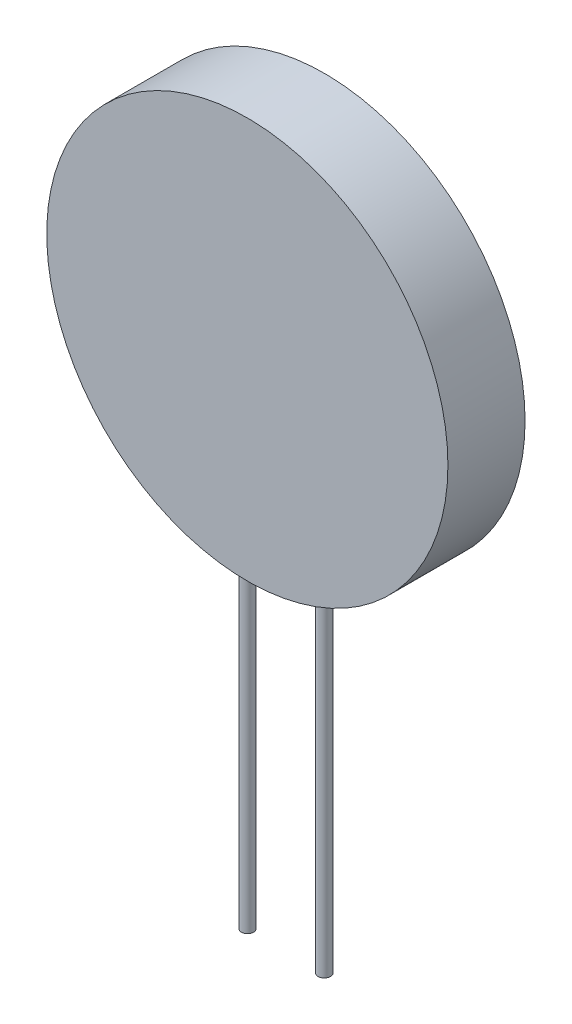
ISO-10303-21;
HEADER;
FILE_DESCRIPTION(('STEP AP214'),'2;1');
FILE_NAME('part.step','',(''),(''),'','','');
FILE_SCHEMA(('AUTOMOTIVE_DESIGN { 1 0 10303 214 1 1 1 1 }'));
ENDSEC;
DATA;
#1=APPLICATION_CONTEXT('core data for automotive mechanical design processes');
#2=APPLICATION_PROTOCOL_DEFINITION('international standard','automotive_design',2000,#1);
#3=PRODUCT_CONTEXT('',#1,'mechanical');
#4=PRODUCT('Part','Part','',(#3));
#5=PRODUCT_RELATED_PRODUCT_CATEGORY('part','',(#4));
#6=PRODUCT_DEFINITION_FORMATION('','',#4);
#7=PRODUCT_DEFINITION_CONTEXT('part definition',#1,'design');
#8=PRODUCT_DEFINITION('design','',#6,#7);
#9=PRODUCT_DEFINITION_SHAPE('','',#8);
#10=(LENGTH_UNIT() NAMED_UNIT(*) SI_UNIT(.MILLI.,.METRE.));
#11=(NAMED_UNIT(*) PLANE_ANGLE_UNIT() SI_UNIT($,.RADIAN.));
#12=(NAMED_UNIT(*) SI_UNIT($,.STERADIAN.) SOLID_ANGLE_UNIT());
#13=UNCERTAINTY_MEASURE_WITH_UNIT(LENGTH_MEASURE(1.E-05),#10,'distance_accuracy_value','');
#14=(GEOMETRIC_REPRESENTATION_CONTEXT(3) GLOBAL_UNCERTAINTY_ASSIGNED_CONTEXT((#13)) GLOBAL_UNIT_ASSIGNED_CONTEXT((#10,
#11,#12)) REPRESENTATION_CONTEXT('',''));
#15=CARTESIAN_POINT('',(0.,0.,0.));
#16=DIRECTION('',(0.,0.,1.));
#17=DIRECTION('',(1.,0.,0.));
#18=AXIS2_PLACEMENT_3D('',#15,#16,#17);
#19=CARTESIAN_POINT('',(0.,0.,2.5));
#20=DIRECTION('',(0.,0.,-1.));
#21=DIRECTION('',(-1.,0.,0.));
#22=AXIS2_PLACEMENT_3D('',#19,#20,#21);
#23=CYLINDRICAL_SURFACE('',#22,13.);
#24=CARTESIAN_POINT('',(0.,0.,2.5));
#25=DIRECTION('',(0.,0.,1.));
#26=DIRECTION('',(1.,0.,0.));
#27=AXIS2_PLACEMENT_3D('',#24,#25,#26);
#28=CIRCLE('',#27,13.);
#29=CARTESIAN_POINT('',(13.,0.,2.5));
#30=VERTEX_POINT('',#29);
#31=EDGE_CURVE('E48',#30,#30,#28,.T.);
#32=ORIENTED_EDGE('',*,*,#31,.F.);
#33=EDGE_LOOP('',(#32));
#34=FACE_BOUND('',#33,.T.);
#35=CARTESIAN_POINT('',(0.,0.,-2.5));
#36=DIRECTION('',(0.,0.,1.));
#37=DIRECTION('',(1.,0.,0.));
#38=AXIS2_PLACEMENT_3D('',#35,#36,#37);
#39=CIRCLE('',#38,13.);
#40=CARTESIAN_POINT('',(13.,0.,-2.5));
#41=VERTEX_POINT('',#40);
#42=EDGE_CURVE('E52',#41,#41,#39,.T.);
#43=ORIENTED_EDGE('',*,*,#42,.T.);
#44=EDGE_LOOP('',(#43));
#45=FACE_BOUND('',#44,.T.);
#46=CARTESIAN_POINT('',(-2.08960272148677,-12.8309610110215,0.));
#47=CARTESIAN_POINT('',(-2.08960373799073,-12.8309608978301,0.0222398605367838));
#48=CARTESIAN_POINT('',(-2.09146413110483,-12.830658298177,0.0444958756498028));
#49=CARTESIAN_POINT('',(-2.09885542368198,-12.8294512501602,0.0883915107107479));
#50=CARTESIAN_POINT('',(-2.10439072581136,-12.8285460798927,0.110030358801036));
#51=CARTESIAN_POINT('',(-2.11896020918535,-12.826147581898,0.152045895993809));
#52=CARTESIAN_POINT('',(-2.12799190807081,-12.8246546714398,0.172423468693234));
#53=CARTESIAN_POINT('',(-2.14927862780559,-12.8211043690579,0.211356919252012));
#54=CARTESIAN_POINT('',(-2.16153290183589,-12.8190471079156,0.229913217817987));
#55=CARTESIAN_POINT('',(-2.18897115961926,-12.8143903207684,0.264793347085037));
#56=CARTESIAN_POINT('',(-2.20416979226967,-12.811788077869,0.281105287002158));
#57=CARTESIAN_POINT('',(-2.23700932972227,-12.8060948949058,0.310948492607148));
#58=CARTESIAN_POINT('',(-2.25465045542046,-12.8030039106371,0.324479506516274));
#59=CARTESIAN_POINT('',(-2.29210155429221,-12.7963524524312,0.348561431270101));
#60=CARTESIAN_POINT('',(-2.31193590167425,-12.7927865882899,0.359072938109383));
#61=CARTESIAN_POINT('',(-2.3530216904105,-12.7852932978957,0.376622847002156));
#62=CARTESIAN_POINT('',(-2.37427324439892,-12.7813658428953,0.383660972630119));
#63=CARTESIAN_POINT('',(-2.41793465766624,-12.7731786360356,0.394177079288246));
#64=CARTESIAN_POINT('',(-2.44035727714906,-12.7689147140188,0.397598846502823));
#65=CARTESIAN_POINT('',(-2.48542644885847,-12.760218735525,0.400615485724884));
#66=CARTESIAN_POINT('',(-2.50807301866162,-12.7557866657724,0.400210054937721));
#67=CARTESIAN_POINT('',(-2.55324641913554,-12.7468219386286,0.395564642860276));
#68=CARTESIAN_POINT('',(-2.57576824560976,-12.7422887159486,0.391276966531212));
#69=CARTESIAN_POINT('',(-2.61976934188948,-12.7333150880234,0.378918075810756));
#70=CARTESIAN_POINT('',(-2.64124856838311,-12.7288746866385,0.370846704384591));
#71=CARTESIAN_POINT('',(-2.68260503004316,-12.7202231926042,0.351107346758831));
#72=CARTESIAN_POINT('',(-2.70247818029169,-12.7160126929901,0.339430532500518));
#73=CARTESIAN_POINT('',(-2.73997916974073,-12.7079849862348,0.312794636144709));
#74=CARTESIAN_POINT('',(-2.75760711190326,-12.7041677610601,0.297835704646094));
#75=CARTESIAN_POINT('',(-2.78988671796372,-12.6971178802203,0.265234791300247));
#76=CARTESIAN_POINT('',(-2.80457106090148,-12.6938788555438,0.247626568304284));
#77=CARTESIAN_POINT('',(-2.83075814828021,-12.6880648191361,0.210086882958711));
#78=CARTESIAN_POINT('',(-2.84226130786786,-12.6854897207652,0.190155724236863));
#79=CARTESIAN_POINT('',(-2.86148979693128,-12.6811660178436,0.149010669523236));
#80=CARTESIAN_POINT('',(-2.86929356757572,-12.6794002813694,0.127835234257458));
#81=CARTESIAN_POINT('',(-2.8812388788387,-12.6766912270594,0.0844255812787788));
#82=CARTESIAN_POINT('',(-2.88538091826665,-12.6757477972073,0.062191508210945));
#83=CARTESIAN_POINT('',(-2.88981677378232,-12.67473723995,0.0177869292950507));
#84=CARTESIAN_POINT('',(-2.89018801540189,-12.6746524815973,-0.00437547167042336));
#85=CARTESIAN_POINT('',(-2.88727179957158,-12.67531710591,-0.0484445774572826));
#86=CARTESIAN_POINT('',(-2.88398454566566,-12.6760664421698,-0.0703512964352672));
#87=CARTESIAN_POINT('',(-2.87389164227378,-12.6783584538894,-0.113147720497484));
#88=CARTESIAN_POINT('',(-2.86710821922494,-12.6798961173404,-0.134042948727458));
#89=CARTESIAN_POINT('',(-2.85025025394391,-12.6836961378972,-0.174388735799368));
#90=CARTESIAN_POINT('',(-2.84017556687887,-12.6859585268947,-0.193839231019245));
#91=CARTESIAN_POINT('',(-2.81690588777598,-12.6911459064697,-0.230995062623859));
#92=CARTESIAN_POINT('',(-2.80367599279727,-12.6940782921255,-0.248677489917065));
#93=CARTESIAN_POINT('',(-2.77455179510602,-12.700475745039,-0.281579268933869));
#94=CARTESIAN_POINT('',(-2.75865720191135,-12.703940870368,-0.296798351769285));
#95=CARTESIAN_POINT('',(-2.7242724233022,-12.7113593019068,-0.324701593666293));
#96=CARTESIAN_POINT('',(-2.70573243577955,-12.7153217403597,-0.337321953991653));
#97=CARTESIAN_POINT('',(-2.66685686352687,-12.7235320903658,-0.359276310152889));
#98=CARTESIAN_POINT('',(-2.64652107599746,-12.7277800341481,-0.368609934223083));
#99=CARTESIAN_POINT('',(-2.60418199074628,-12.7365109921448,-0.38391198637108));
#100=CARTESIAN_POINT('',(-2.58215324221612,-12.7409970263043,-0.389808341231155));
#101=CARTESIAN_POINT('',(-2.53741681754539,-12.749981817263,-0.397781510381679));
#102=CARTESIAN_POINT('',(-2.51470909730685,-12.7544805748713,-0.399858076033899));
#103=CARTESIAN_POINT('',(-2.46905146792026,-12.7633980725654,-0.400128978558008));
#104=CARTESIAN_POINT('',(-2.44610114893575,-12.7678157986782,-0.398289946794614));
#105=CARTESIAN_POINT('',(-2.40081033199212,-12.776409558456,-0.390695672597628));
#106=CARTESIAN_POINT('',(-2.37846982695705,-12.7805855949261,-0.384940475625146));
#107=CARTESIAN_POINT('',(-2.33516502425353,-12.788568604974,-0.369693392587954));
#108=CARTESIAN_POINT('',(-2.314194214055,-12.792377373471,-0.360220961386459));
#109=CARTESIAN_POINT('',(-2.2741300465451,-12.7995604288877,-0.337784698543555));
#110=CARTESIAN_POINT('',(-2.25503648672822,-12.8029347626836,-0.324821244056282));
#111=CARTESIAN_POINT('',(-2.21956109971627,-12.8091322465151,-0.295961336729012));
#112=CARTESIAN_POINT('',(-2.20314512403904,-12.8119624363495,-0.280108375573142));
#113=CARTESIAN_POINT('',(-2.17320630533207,-12.8170747708293,-0.245788038404536));
#114=CARTESIAN_POINT('',(-2.15968394722827,-12.8193568236232,-0.227320225043002));
#115=CARTESIAN_POINT('',(-2.13613651702684,-12.8233015127359,-0.188594519710692));
#116=CARTESIAN_POINT('',(-2.12606286639995,-12.8249727774688,-0.168367000723547));
#117=CARTESIAN_POINT('',(-2.10946188864964,-12.8277138274918,-0.12648726313211));
#118=CARTESIAN_POINT('',(-2.10292999414526,-12.8287843875015,-0.104836919989325));
#119=CARTESIAN_POINT('',(-2.09538822265311,-12.8300177719673,-0.0692001486621924));
#120=CARTESIAN_POINT('',(-2.09322157337608,-12.8303712191972,-0.0554542506735139));
#121=CARTESIAN_POINT('',(-2.09032850953351,-12.8308428733699,-0.0278076734072789));
#122=CARTESIAN_POINT('',(-2.0896020858481,-12.8309610818023,-0.0139069951103911));
#123=CARTESIAN_POINT('',(-2.08960272148677,-12.8309610110215,0.));
#124=B_SPLINE_CURVE_WITH_KNOTS('',3,(#46,#47,#48,#49,#50,#51,#52,#53,#54,#55,#56,#57,#58,#59,
#60,#61,#62,#63,#64,#65,#66,#67,#68,#69,#70,#71,#72,#73,#74,#75,#76,#77,#78,#79,#80,#81,#82,#83,
#84,#85,#86,#87,#88,#89,#90,#91,#92,#93,#94,#95,#96,#97,#98,#99,#100,#101,#102,#103,#104,#105,
#106,#107,#108,#109,#110,#111,#112,#113,#114,#115,#116,#117,#118,#119,#120,#121,#122,#123),
.UNSPECIFIED.,.T.,.F.,(4,2,2,2,2,2,2,2,2,2,2,2,2,2,2,2,2,2,2,2,2,2,2,2,2,2,2,2,2,2,2,2,2,2,2,2,
2,2,4),(0.,0.0666685247402091,0.13341706512499,0.200118302277197,0.266804095282988,
0.333830606691347,0.400863183857568,0.468734445840088,0.536611108417586,0.605528010622263,
0.67445036533919,0.744231122853805,0.814014776737047,0.883970671910479,0.953923357851443,
1.02305023402431,1.09216808482933,1.15974638651274,1.22731548110602,1.29349430871432,
1.35966945458309,1.42542899694764,1.49119143346637,1.5577181508454,1.62425212510723,
1.69226362721723,1.76028281969998,1.82968122928618,1.89908415600307,1.96908089895403,
2.03907682935617,2.10871120622907,2.17833806313939,2.24699249196255,2.31565841722089,
2.38331294898026,2.45088002598709,2.49256934850356,2.53425840703186),.UNSPECIFIED.);
#125=CARTESIAN_POINT('',(-2.08960272148677,-12.8309610110215,0.));
#126=VERTEX_POINT('',#125);
#127=EDGE_CURVE('E44',#126,#126,#124,.T.);
#128=ORIENTED_EDGE('',*,*,#127,.F.);
#129=EDGE_LOOP('',(#128));
#130=FACE_BOUND('',#129,.T.);
#131=CARTESIAN_POINT('',(2.88960272148678,-12.6747858408723,0.));
#132=CARTESIAN_POINT('',(2.88960167513964,-12.6747861320561,0.0220680817173026));
#133=CARTESIAN_POINT('',(2.88776955378347,-12.675204199242,0.0441523492490454));
#134=CARTESIAN_POINT('',(2.8804947310231,-12.6768593685504,0.0877041873012165));
#135=CARTESIAN_POINT('',(2.87504766705555,-12.6780974602863,0.109170979945506));
#136=CARTESIAN_POINT('',(2.86072447237477,-12.6813370358789,0.15084216346349));
#137=CARTESIAN_POINT('',(2.85185196090461,-12.6833377139775,0.171047860691334));
#138=CARTESIAN_POINT('',(2.83095720216421,-12.6880177881711,0.209664373184383));
#139=CARTESIAN_POINT('',(2.81893555227351,-12.6906970555372,0.228075527959556));
#140=CARTESIAN_POINT('',(2.79194013808813,-12.6966634610763,0.262834611988127));
#141=CARTESIAN_POINT('',(2.77693297619155,-12.6999574473428,0.279155409961254));
#142=CARTESIAN_POINT('',(2.74449426885767,-12.7070069753872,0.309058426496839));
#143=CARTESIAN_POINT('',(2.72706237425361,-12.7107625836305,0.322640249949732));
#144=CARTESIAN_POINT('',(2.68983326213138,-12.7186936005585,0.347007080556356));
#145=CARTESIAN_POINT('',(2.66999086571486,-12.7228766776116,0.357720580650957));
#146=CARTESIAN_POINT('',(2.62882806631305,-12.7314455079346,0.375660096515587));
#147=CARTESIAN_POINT('',(2.6075075090438,-12.7358312823453,0.382885747610597));
#148=CARTESIAN_POINT('',(2.56359003123537,-12.7447446601859,0.393759327379643));
#149=CARTESIAN_POINT('',(2.5409773503041,-12.749273403468,0.397342768134095));
#150=CARTESIAN_POINT('',(2.49545760596443,-12.7582612271324,0.400607595492246));
#151=CARTESIAN_POINT('',(2.47255053146463,-12.7627203048758,0.400288834645993));
#152=CARTESIAN_POINT('',(2.42699348067238,-12.7714620490317,0.395735075171582));
#153=CARTESIAN_POINT('',(2.40434496942715,-12.7757439048361,0.391483798396414));
#154=CARTESIAN_POINT('',(2.3600601400095,-12.7839987377104,0.37913985600124));
#155=CARTESIAN_POINT('',(2.33842378850191,-12.7879717249556,0.371047316990064));
#156=CARTESIAN_POINT('',(2.2969862747278,-12.7954794411682,0.351313241256895));
#157=CARTESIAN_POINT('',(2.277170927679,-12.7990176459161,0.339702830437744));
#158=CARTESIAN_POINT('',(2.2397652939228,-12.8056164496964,0.313219191699257));
#159=CARTESIAN_POINT('',(2.22217483216789,-12.8086770863068,0.298346220720742));
#160=CARTESIAN_POINT('',(2.1900071096802,-12.814216008568,0.26599805964127));
#161=CARTESIAN_POINT('',(2.17538856038143,-12.8167023503933,0.248565308626801));
#162=CARTESIAN_POINT('',(2.14928878548744,-12.821105002317,0.211427050135842));
#163=CARTESIAN_POINT('',(2.1378073036436,-12.8230213589752,0.191721728479396));
#164=CARTESIAN_POINT('',(2.11848215716929,-12.8262281433352,0.150904289351843));
#165=CARTESIAN_POINT('',(2.11058849463879,-12.8275271860256,0.129816512333092));
#166=CARTESIAN_POINT('',(2.09844277770146,-12.8295197163226,0.0865899268017942));
#167=CARTESIAN_POINT('',(2.09419050779972,-12.8302132397634,0.0644511805666707));
#168=CARTESIAN_POINT('',(2.08948201563094,-12.8309808909791,0.0199728501451308));
#169=CARTESIAN_POINT('',(2.08899073026536,-12.8310607399768,-0.00236293040489008));
#170=CARTESIAN_POINT('',(2.09172670345199,-12.830614999154,-0.0467990373720215));
#171=CARTESIAN_POINT('',(2.09495386548706,-12.830089425048,-0.0688993698854651));
#172=CARTESIAN_POINT('',(2.10501471823338,-12.8284425652562,-0.112180502570183));
#173=CARTESIAN_POINT('',(2.11183928749472,-12.8273227861665,-0.133363482406011));
#174=CARTESIAN_POINT('',(2.12888223131816,-12.8245052383735,-0.174275094103384));
#175=CARTESIAN_POINT('',(2.13910063918227,-12.8228074639986,-0.194003711691695));
#176=CARTESIAN_POINT('',(2.16267878177208,-12.8188518780046,-0.231547689132098));
#177=CARTESIAN_POINT('',(2.17605255506259,-12.8165915610329,-0.249353964694519));
#178=CARTESIAN_POINT('',(2.20551906468484,-12.8115537121117,-0.282467258408752));
#179=CARTESIAN_POINT('',(2.22161192581411,-12.8087761564219,-0.297774161783866));
#180=CARTESIAN_POINT('',(2.25623744171329,-12.8027225319511,-0.325637534385514));
#181=CARTESIAN_POINT('',(2.27479473248418,-12.7994413689717,-0.338162272802735));
#182=CARTESIAN_POINT('',(2.31367509165352,-12.7924703351797,-0.35992488235027));
#183=CARTESIAN_POINT('',(2.333998289497,-12.7887804344003,-0.36916251227471));
#184=CARTESIAN_POINT('',(2.3761526674483,-12.7810157722468,-0.384236314543838));
#185=CARTESIAN_POINT('',(2.39800182118487,-12.7769360905726,-0.390019686466208));
#186=CARTESIAN_POINT('',(2.44231705280342,-12.7685393052411,-0.397832153016473));
#187=CARTESIAN_POINT('',(2.46478318409415,-12.7642221809968,-0.399860921580332));
#188=CARTESIAN_POINT('',(2.5100316642922,-12.7554019801175,-0.400127092121619));
#189=CARTESIAN_POINT('',(2.53281399691645,-12.7508971381358,-0.398310530079566));
#190=CARTESIAN_POINT('',(2.57774037596942,-12.7418907439658,-0.390832966769393));
#191=CARTESIAN_POINT('',(2.59988438428968,-12.7373891919895,-0.385171736465082));
#192=CARTESIAN_POINT('',(2.64305182418605,-12.7285021125978,-0.370107088864126));
#193=CARTESIAN_POINT('',(2.66406720123063,-12.7241175091334,-0.360680016668852));
#194=CARTESIAN_POINT('',(2.7042166465067,-12.7156452360317,-0.33833213984431));
#195=CARTESIAN_POINT('',(2.72335081320567,-12.7115575508559,-0.325411518209482));
#196=CARTESIAN_POINT('',(2.75903757877714,-12.7038593752574,-0.296526539735352));
#197=CARTESIAN_POINT('',(2.77560803452795,-12.700245613507,-0.280585134365697));
#198=CARTESIAN_POINT('',(2.80582778812062,-12.6936035267455,-0.2460253191393));
#199=CARTESIAN_POINT('',(2.81947666031382,-12.6905752870459,-0.22740651986985));
#200=CARTESIAN_POINT('',(2.8431734404403,-12.6852871391388,-0.188410253570036));
#201=CARTESIAN_POINT('',(2.85328625724307,-12.6830134253721,-0.168074063277053));
#202=CARTESIAN_POINT('',(2.86993312295362,-12.6792569763446,-0.125938290769012));
#203=CARTESIAN_POINT('',(2.87647216895383,-12.6777731367033,-0.104140800004325));
#204=CARTESIAN_POINT('',(2.88393643667342,-12.6760766125988,-0.0684875878009299));
#205=CARTESIAN_POINT('',(2.88605825860567,-12.675593471746,-0.0548835521888359));
#206=CARTESIAN_POINT('',(2.88889171751456,-12.6749479973066,-0.0275217751136062));
#207=CARTESIAN_POINT('',(2.8896033741017,-12.6747856592586,-0.0137640357906307));
#208=CARTESIAN_POINT('',(2.88960272148678,-12.6747858408723,0.));
#209=B_SPLINE_CURVE_WITH_KNOTS('',3,(#131,#132,#133,#134,#135,#136,#137,#138,#139,#140,#141,
#142,#143,#144,#145,#146,#147,#148,#149,#150,#151,#152,#153,#154,#155,#156,#157,#158,#159,#160,
#161,#162,#163,#164,#165,#166,#167,#168,#169,#170,#171,#172,#173,#174,#175,#176,#177,#178,#179,
#180,#181,#182,#183,#184,#185,#186,#187,#188,#189,#190,#191,#192,#193,#194,#195,#196,#197,#198,
#199,#200,#201,#202,#203,#204,#205,#206,#207,#208),.UNSPECIFIED.,.T.,.F.,(4,2,2,2,2,2,2,2,2,2,2,
2,2,2,2,2,2,2,2,2,2,2,2,2,2,2,2,2,2,2,2,2,2,2,2,2,2,2,4),(0.,0.0661532794782408,
0.132386539189302,0.198550009152253,0.264700937234672,0.331638312705952,0.398585337302634,
0.467072055410057,0.535565932654372,0.605252460350345,0.674941621253935,0.744920548644313,
0.814897169674324,0.884271877956333,0.953641124638175,1.02196848147648,1.09029025538479,
1.15762831696933,1.22496239326207,1.2916679504089,1.35837177616525,1.42490727805671,
1.49144343284629,1.55828139024147,1.62512241612074,1.6926905453396,1.76026363164171,
1.82884480400568,1.8974319319401,1.96698796346478,2.0365481389741,2.10655230140487,
2.17655279768123,2.24604134482368,2.31554000894741,2.38368616526271,2.45173678954147,
2.49299768302236,2.53425800270353),.UNSPECIFIED.);
#210=CARTESIAN_POINT('',(2.88960272148678,-12.6747858408723,0.));
#211=VERTEX_POINT('',#210);
#212=EDGE_CURVE('E10',#211,#211,#209,.T.);
#213=ORIENTED_EDGE('',*,*,#212,.F.);
#214=EDGE_LOOP('',(#213));
#215=FACE_BOUND('',#214,.T.);
#216=ADVANCED_FACE('F33',(#34,#45,#130,#215),#23,.T.);
#217=CARTESIAN_POINT('',(0.,0.,2.5));
#218=DIRECTION('',(0.,0.,1.));
#219=DIRECTION('',(1.,0.,0.));
#220=AXIS2_PLACEMENT_3D('',#217,#218,#219);
#221=PLANE('',#220);
#222=ORIENTED_EDGE('',*,*,#31,.T.);
#223=EDGE_LOOP('',(#222));
#224=FACE_BOUND('',#223,.T.);
#225=ADVANCED_FACE('F72',(#224),#221,.T.);
#226=CARTESIAN_POINT('',(0.,0.,-2.5));
#227=DIRECTION('',(0.,0.,1.));
#228=DIRECTION('',(1.,0.,0.));
#229=AXIS2_PLACEMENT_3D('',#226,#227,#228);
#230=PLANE('',#229);
#231=ORIENTED_EDGE('',*,*,#42,.F.);
#232=EDGE_LOOP('',(#231));
#233=FACE_BOUND('',#232,.T.);
#234=ADVANCED_FACE('F65',(#233),#230,.F.);
#235=CARTESIAN_POINT('',(-2.48960272148678,0.,0.));
#236=DIRECTION('',(0.,-1.,0.));
#237=DIRECTION('',(1.,0.,0.));
#238=AXIS2_PLACEMENT_3D('',#235,#236,#237);
#239=CYLINDRICAL_SURFACE('',#238,0.4);
#240=CARTESIAN_POINT('',(-2.48960272148677,-35.,0.));
#241=DIRECTION('',(0.,1.,0.));
#242=DIRECTION('',(0.,0.,1.));
#243=AXIS2_PLACEMENT_3D('',#240,#241,#242);
#244=CIRCLE('',#243,0.4);
#245=CARTESIAN_POINT('',(-2.48960272148677,-35.,0.4));
#246=VERTEX_POINT('',#245);
#247=EDGE_CURVE('E89',#246,#246,#244,.T.);
#248=ORIENTED_EDGE('',*,*,#247,.T.);
#249=EDGE_LOOP('',(#248));
#250=FACE_BOUND('',#249,.T.);
#251=ORIENTED_EDGE('',*,*,#127,.T.);
#252=EDGE_LOOP('',(#251));
#253=FACE_BOUND('',#252,.T.);
#254=ADVANCED_FACE('F59',(#250,#253),#239,.T.);
#255=CARTESIAN_POINT('',(-2.48960272148677,-35.,0.));
#256=DIRECTION('',(0.,1.,0.));
#257=DIRECTION('',(0.,0.,1.));
#258=AXIS2_PLACEMENT_3D('',#255,#256,#257);
#259=PLANE('',#258);
#260=ORIENTED_EDGE('',*,*,#247,.F.);
#261=EDGE_LOOP('',(#260));
#262=FACE_BOUND('',#261,.T.);
#263=ADVANCED_FACE('F64',(#262),#259,.F.);
#264=CARTESIAN_POINT('',(2.48960272148678,0.,0.));
#265=DIRECTION('',(0.,-1.,0.));
#266=DIRECTION('',(1.,0.,0.));
#267=AXIS2_PLACEMENT_3D('',#264,#265,#266);
#268=CYLINDRICAL_SURFACE('',#267,0.4);
#269=CARTESIAN_POINT('',(2.48960272148677,-35.,0.));
#270=DIRECTION('',(0.,-1.,0.));
#271=DIRECTION('',(0.,0.,1.));
#272=AXIS2_PLACEMENT_3D('',#269,#270,#271);
#273=CIRCLE('',#272,0.4);
#274=CARTESIAN_POINT('',(2.48960272148677,-35.,0.4));
#275=VERTEX_POINT('',#274);
#276=EDGE_CURVE('E91',#275,#275,#273,.F.);
#277=ORIENTED_EDGE('',*,*,#276,.T.);
#278=EDGE_LOOP('',(#277));
#279=FACE_BOUND('',#278,.T.);
#280=ORIENTED_EDGE('',*,*,#212,.T.);
#281=EDGE_LOOP('',(#280));
#282=FACE_BOUND('',#281,.T.);
#283=ADVANCED_FACE('F70',(#279,#282),#268,.T.);
#284=CARTESIAN_POINT('',(2.48960272148677,-35.,0.));
#285=DIRECTION('',(0.,1.,0.));
#286=DIRECTION('',(0.,0.,1.));
#287=AXIS2_PLACEMENT_3D('',#284,#285,#286);
#288=PLANE('',#287);
#289=ORIENTED_EDGE('',*,*,#276,.F.);
#290=EDGE_LOOP('',(#289));
#291=FACE_BOUND('',#290,.T.);
#292=ADVANCED_FACE('F67',(#291),#288,.F.);
#293=CLOSED_SHELL('',(#216,#225,#234,#254,#263,#283,#292));
#294=MANIFOLD_SOLID_BREP('B2',#293);
#295=ADVANCED_BREP_SHAPE_REPRESENTATION('',(#18,#294),#14);
#296=SHAPE_DEFINITION_REPRESENTATION(#9,#295);
ENDSEC;
END-ISO-10303-21;
